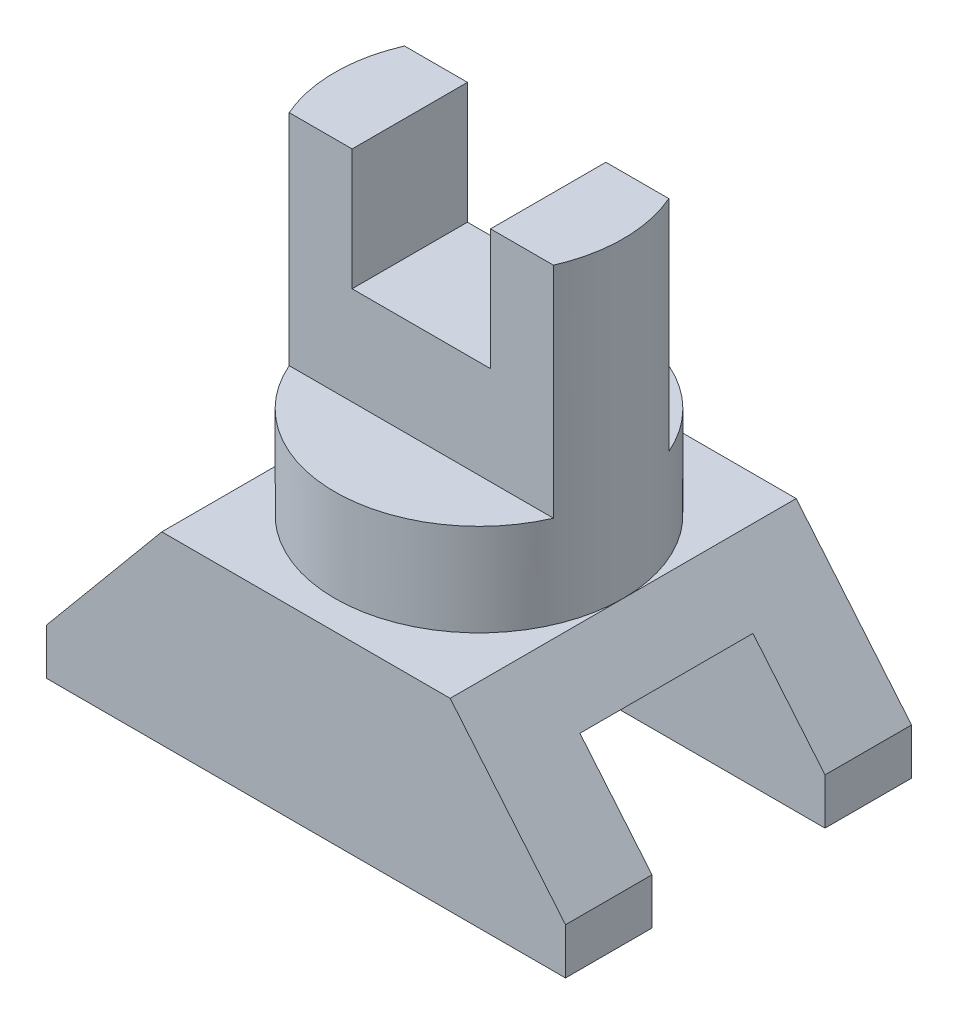
ISO-10303-21;
HEADER;
FILE_DESCRIPTION(('STEP AP214'),'2;1');
FILE_NAME('part.step','',(''),(''),'','','');
FILE_SCHEMA(('AUTOMOTIVE_DESIGN { 1 0 10303 214 1 1 1 1 }'));
ENDSEC;
DATA;
#1=APPLICATION_CONTEXT('core data for automotive mechanical design processes');
#2=APPLICATION_PROTOCOL_DEFINITION('international standard','automotive_design',2000,#1);
#3=PRODUCT_CONTEXT('',#1,'mechanical');
#4=PRODUCT('Part','Part','',(#3));
#5=PRODUCT_RELATED_PRODUCT_CATEGORY('part','',(#4));
#6=PRODUCT_DEFINITION_FORMATION('','',#4);
#7=PRODUCT_DEFINITION_CONTEXT('part definition',#1,'design');
#8=PRODUCT_DEFINITION('design','',#6,#7);
#9=PRODUCT_DEFINITION_SHAPE('','',#8);
#10=(LENGTH_UNIT() NAMED_UNIT(*) SI_UNIT(.MILLI.,.METRE.));
#11=(NAMED_UNIT(*) PLANE_ANGLE_UNIT() SI_UNIT($,.RADIAN.));
#12=(NAMED_UNIT(*) SI_UNIT($,.STERADIAN.) SOLID_ANGLE_UNIT());
#13=UNCERTAINTY_MEASURE_WITH_UNIT(LENGTH_MEASURE(1.E-05),#10,'distance_accuracy_value','');
#14=(GEOMETRIC_REPRESENTATION_CONTEXT(3) GLOBAL_UNCERTAINTY_ASSIGNED_CONTEXT((#13)) GLOBAL_UNIT_ASSIGNED_CONTEXT((#10,
#11,#12)) REPRESENTATION_CONTEXT('',''));
#15=CARTESIAN_POINT('',(0.,0.,0.));
#16=DIRECTION('',(0.,0.,1.));
#17=DIRECTION('',(1.,0.,0.));
#18=AXIS2_PLACEMENT_3D('',#15,#16,#17);
#19=CARTESIAN_POINT('',(-55.4325271535581,-19.0427034456929,60.));
#20=DIRECTION('',(1.,0.,0.));
#21=DIRECTION('',(0.,0.,-1.));
#22=AXIS2_PLACEMENT_3D('',#19,#20,#21);
#23=PLANE('',#22);
#24=DIRECTION('',(0.,0.,-1.));
#25=VECTOR('',#24,1.);
#26=CARTESIAN_POINT('',(-55.4325271535581,-19.0427034456929,60.));
#27=LINE('',#26,#25);
#28=CARTESIAN_POINT('',(-55.4325271535581,-19.0427034456929,60.));
#29=VERTEX_POINT('',#28);
#30=CARTESIAN_POINT('',(-55.4325271535581,-19.0427034456929,45.));
#31=VERTEX_POINT('',#30);
#32=EDGE_CURVE('E221',#29,#31,#27,.T.);
#33=ORIENTED_EDGE('',*,*,#32,.T.);
#34=DIRECTION('',(0.,-1.,0.));
#35=VECTOR('',#34,1.);
#36=CARTESIAN_POINT('',(-55.4325271535581,-19.0427034456929,45.));
#37=LINE('',#36,#35);
#38=CARTESIAN_POINT('',(-55.4325271535581,-27.0427034456929,45.));
#39=VERTEX_POINT('',#38);
#40=EDGE_CURVE('E262',#31,#39,#37,.T.);
#41=ORIENTED_EDGE('',*,*,#40,.T.);
#42=DIRECTION('',(0.,0.,-1.));
#43=VECTOR('',#42,1.);
#44=CARTESIAN_POINT('',(-55.4325271535581,-27.0427034456929,60.));
#45=LINE('',#44,#43);
#46=CARTESIAN_POINT('',(-55.4325271535581,-27.0427034456929,60.));
#47=VERTEX_POINT('',#46);
#48=EDGE_CURVE('E202',#47,#39,#45,.T.);
#49=ORIENTED_EDGE('',*,*,#48,.F.);
#50=DIRECTION('',(0.,-1.,0.));
#51=VECTOR('',#50,1.);
#52=CARTESIAN_POINT('',(-55.4325271535581,-19.0427034456929,60.));
#53=LINE('',#52,#51);
#54=EDGE_CURVE('E359',#29,#47,#53,.T.);
#55=ORIENTED_EDGE('',*,*,#54,.F.);
#56=EDGE_LOOP('',(#33,#41,#49,#55));
#57=FACE_BOUND('',#56,.T.);
#58=ADVANCED_FACE('F39',(#57),#23,.F.);
#59=CARTESIAN_POINT('',(-55.4325271535581,-27.0427034456929,60.));
#60=DIRECTION('',(0.,1.,0.));
#61=DIRECTION('',(0.,0.,1.));
#62=AXIS2_PLACEMENT_3D('',#59,#60,#61);
#63=PLANE('',#62);
#64=ORIENTED_EDGE('',*,*,#48,.T.);
#65=DIRECTION('',(1.,0.,0.));
#66=VECTOR('',#65,1.);
#67=CARTESIAN_POINT('',(-75.4325271535581,-27.0427034456929,45.));
#68=LINE('',#67,#66);
#69=CARTESIAN_POINT('',(34.5674728464419,-27.0427034456929,45.));
#70=VERTEX_POINT('',#69);
#71=EDGE_CURVE('E186',#39,#70,#68,.T.);
#72=ORIENTED_EDGE('',*,*,#71,.T.);
#73=DIRECTION('',(0.,0.,-1.));
#74=VECTOR('',#73,1.);
#75=CARTESIAN_POINT('',(34.5674728464419,-27.0427034456929,60.));
#76=LINE('',#75,#74);
#77=CARTESIAN_POINT('',(34.5674728464419,-27.0427034456929,60.));
#78=VERTEX_POINT('',#77);
#79=EDGE_CURVE('E199',#78,#70,#76,.T.);
#80=ORIENTED_EDGE('',*,*,#79,.F.);
#81=DIRECTION('',(1.,0.,0.));
#82=VECTOR('',#81,1.);
#83=CARTESIAN_POINT('',(-55.4325271535581,-27.0427034456929,60.));
#84=LINE('',#83,#82);
#85=EDGE_CURVE('E363',#47,#78,#84,.T.);
#86=ORIENTED_EDGE('',*,*,#85,.F.);
#87=EDGE_LOOP('',(#64,#72,#80,#86));
#88=FACE_BOUND('',#87,.T.);
#89=ADVANCED_FACE('F197',(#88),#63,.F.);
#90=CARTESIAN_POINT('',(34.5674728464419,-27.0427034456929,60.));
#91=DIRECTION('',(-1.,0.,0.));
#92=DIRECTION('',(0.,0.,1.));
#93=AXIS2_PLACEMENT_3D('',#90,#91,#92);
#94=PLANE('',#93);
#95=ORIENTED_EDGE('',*,*,#79,.T.);
#96=DIRECTION('',(0.,-1.,0.));
#97=VECTOR('',#96,1.);
#98=CARTESIAN_POINT('',(34.5674728464419,-27.0427034456929,45.));
#99=LINE('',#98,#97);
#100=CARTESIAN_POINT('',(34.5674728464419,-19.0427034456929,45.));
#101=VERTEX_POINT('',#100);
#102=EDGE_CURVE('E182',#101,#70,#99,.T.);
#103=ORIENTED_EDGE('',*,*,#102,.F.);
#104=DIRECTION('',(0.,0.,-1.));
#105=VECTOR('',#104,1.);
#106=CARTESIAN_POINT('',(34.5674728464419,-19.0427034456929,60.));
#107=LINE('',#106,#105);
#108=CARTESIAN_POINT('',(34.5674728464419,-19.0427034456929,60.));
#109=VERTEX_POINT('',#108);
#110=EDGE_CURVE('E215',#109,#101,#107,.T.);
#111=ORIENTED_EDGE('',*,*,#110,.F.);
#112=DIRECTION('',(0.,1.,0.));
#113=VECTOR('',#112,1.);
#114=CARTESIAN_POINT('',(34.5674728464419,-27.0427034456929,60.));
#115=LINE('',#114,#113);
#116=EDGE_CURVE('E207',#78,#109,#115,.T.);
#117=ORIENTED_EDGE('',*,*,#116,.F.);
#118=EDGE_LOOP('',(#95,#103,#111,#117));
#119=FACE_BOUND('',#118,.T.);
#120=ADVANCED_FACE('F206',(#119),#94,.F.);
#121=CARTESIAN_POINT('',(-10.4325271535581,20.9572965543071,30.));
#122=DIRECTION('',(0.,1.,0.));
#123=DIRECTION('',(0.,0.,1.));
#124=AXIS2_PLACEMENT_3D('',#121,#122,#123);
#125=PLANE('',#124);
#126=CARTESIAN_POINT('',(-10.4325271535581,20.9572965543071,30.));
#127=DIRECTION('',(0.,1.,0.));
#128=DIRECTION('',(0.,0.,1.));
#129=AXIS2_PLACEMENT_3D('',#126,#127,#128);
#130=CIRCLE('',#129,25.);
#131=CARTESIAN_POINT('',(-33.3454056283373,20.9572965543071,40.));
#132=VERTEX_POINT('',#131);
#133=CARTESIAN_POINT('',(12.4803513212211,20.9572965543071,40.));
#134=VERTEX_POINT('',#133);
#135=EDGE_CURVE('E347',#132,#134,#130,.T.);
#136=ORIENTED_EDGE('',*,*,#135,.T.);
#137=DIRECTION('',(1.,0.,0.));
#138=VECTOR('',#137,1.);
#139=CARTESIAN_POINT('',(0.,20.9572965543071,40.));
#140=LINE('',#139,#138);
#141=EDGE_CURVE('E62',#132,#134,#140,.T.);
#142=ORIENTED_EDGE('',*,*,#141,.F.);
#143=EDGE_LOOP('',(#136,#142));
#144=FACE_BOUND('',#143,.T.);
#145=ADVANCED_FACE('F464',(#144),#125,.T.);
#146=CARTESIAN_POINT('',(-35.4325271535581,4.95729655430712,60.));
#147=DIRECTION('',(0.,-1.,0.));
#148=DIRECTION('',(0.,0.,-1.));
#149=AXIS2_PLACEMENT_3D('',#146,#147,#148);
#150=PLANE('',#149);
#151=CARTESIAN_POINT('',(-10.4325271535581,4.95729655430712,30.));
#152=DIRECTION('',(0.,1.,0.));
#153=DIRECTION('',(0.,0.,1.));
#154=AXIS2_PLACEMENT_3D('',#151,#152,#153);
#155=CIRCLE('',#154,25.);
#156=CARTESIAN_POINT('',(14.5674728464419,4.95729655430712,30.));
#157=VERTEX_POINT('',#156);
#158=CARTESIAN_POINT('',(-35.4325271535581,4.95729655430712,30.));
#159=VERTEX_POINT('',#158);
#160=EDGE_CURVE('E342',#157,#159,#155,.T.);
#161=ORIENTED_EDGE('',*,*,#160,.F.);
#162=DIRECTION('',(0.,0.,-1.));
#163=VECTOR('',#162,1.);
#164=CARTESIAN_POINT('',(14.5674728464419,4.95729655430712,60.));
#165=LINE('',#164,#163);
#166=CARTESIAN_POINT('',(14.5674728464419,4.95729655430712,0.));
#167=VERTEX_POINT('',#166);
#168=EDGE_CURVE('E400',#157,#167,#165,.T.);
#169=ORIENTED_EDGE('',*,*,#168,.T.);
#170=DIRECTION('',(-1.,0.,0.));
#171=VECTOR('',#170,1.);
#172=CARTESIAN_POINT('',(-35.4325271535581,4.95729655430712,0.));
#173=LINE('',#172,#171);
#174=CARTESIAN_POINT('',(-35.4325271535581,4.95729655430712,0.));
#175=VERTEX_POINT('',#174);
#176=EDGE_CURVE('E360',#167,#175,#173,.T.);
#177=ORIENTED_EDGE('',*,*,#176,.T.);
#178=DIRECTION('',(0.,0.,-1.));
#179=VECTOR('',#178,1.);
#180=CARTESIAN_POINT('',(-35.4325271535581,4.95729655430712,60.));
#181=LINE('',#180,#179);
#182=EDGE_CURVE('E374',#159,#175,#181,.T.);
#183=ORIENTED_EDGE('',*,*,#182,.F.);
#184=EDGE_LOOP('',(#161,#169,#177,#183));
#185=FACE_BOUND('',#184,.T.);
#186=ADVANCED_FACE('F412',(#185),#150,.F.);
#187=CARTESIAN_POINT('',(-35.4325271535581,4.95729655430712,60.));
#188=DIRECTION('',(0.768221279597376,-0.64018439966448,0.));
#189=DIRECTION('',(0.64018439966448,0.768221279597376,0.));
#190=AXIS2_PLACEMENT_3D('',#187,#188,#189);
#191=PLANE('',#190);
#192=DIRECTION('',(0.,0.,1.));
#193=VECTOR('',#192,1.);
#194=CARTESIAN_POINT('',(-42.9325271535581,-4.04270344569288,60.));
#195=LINE('',#194,#193);
#196=CARTESIAN_POINT('',(-42.9325271535581,-4.04270344569288,15.));
#197=VERTEX_POINT('',#196);
#198=CARTESIAN_POINT('',(-42.9325271535581,-4.04270344569288,45.));
#199=VERTEX_POINT('',#198);
#200=EDGE_CURVE('E259',#197,#199,#195,.T.);
#201=ORIENTED_EDGE('',*,*,#200,.T.);
#202=DIRECTION('',(-0.64018439966448,-0.768221279597376,0.));
#203=VECTOR('',#202,1.);
#204=CARTESIAN_POINT('',(-35.4325271535581,4.95729655430712,45.));
#205=LINE('',#204,#203);
#206=EDGE_CURVE('E242',#199,#31,#205,.T.);
#207=ORIENTED_EDGE('',*,*,#206,.T.);
#208=ORIENTED_EDGE('',*,*,#32,.F.);
#209=DIRECTION('',(-0.64018439966448,-0.768221279597376,0.));
#210=VECTOR('',#209,1.);
#211=CARTESIAN_POINT('',(-35.4325271535581,4.95729655430712,60.));
#212=LINE('',#211,#210);
#213=CARTESIAN_POINT('',(-35.4325271535581,4.95729655430712,60.));
#214=VERTEX_POINT('',#213);
#215=EDGE_CURVE('E355',#214,#29,#212,.T.);
#216=ORIENTED_EDGE('',*,*,#215,.F.);
#217=EDGE_CURVE('E397',#214,#159,#181,.T.);
#218=ORIENTED_EDGE('',*,*,#217,.T.);
#219=ORIENTED_EDGE('',*,*,#182,.T.);
#220=DIRECTION('',(-0.64018439966448,-0.768221279597376,0.));
#221=VECTOR('',#220,1.);
#222=CARTESIAN_POINT('',(-35.4325271535581,4.95729655430712,0.));
#223=LINE('',#222,#221);
#224=CARTESIAN_POINT('',(-55.4325271535581,-19.0427034456929,0.));
#225=VERTEX_POINT('',#224);
#226=EDGE_CURVE('E350',#175,#225,#223,.T.);
#227=ORIENTED_EDGE('',*,*,#226,.T.);
#228=CARTESIAN_POINT('',(-55.4325271535581,-19.0427034456929,15.));
#229=VERTEX_POINT('',#228);
#230=EDGE_CURVE('E220',#229,#225,#27,.T.);
#231=ORIENTED_EDGE('',*,*,#230,.F.);
#232=DIRECTION('',(0.64018439966448,0.768221279597376,0.));
#233=VECTOR('',#232,1.);
#234=CARTESIAN_POINT('',(-35.4325271535581,4.95729655430712,15.));
#235=LINE('',#234,#233);
#236=EDGE_CURVE('E249',#229,#197,#235,.T.);
#237=ORIENTED_EDGE('',*,*,#236,.T.);
#238=EDGE_LOOP('',(#201,#207,#208,#216,#218,#219,#227,#231,#237));
#239=FACE_BOUND('',#238,.T.);
#240=ADVANCED_FACE('F41',(#239),#191,.F.);
#241=CARTESIAN_POINT('',(-55.4325271535581,-27.0427034456929,15.));
#242=VERTEX_POINT('',#241);
#243=CARTESIAN_POINT('',(-55.4325271535581,-27.0427034456929,0.));
#244=VERTEX_POINT('',#243);
#245=EDGE_CURVE('E209',#242,#244,#45,.T.);
#246=ORIENTED_EDGE('',*,*,#245,.F.);
#247=DIRECTION('',(0.,1.,0.));
#248=VECTOR('',#247,1.);
#249=CARTESIAN_POINT('',(-55.4325271535581,-19.0427034456929,15.));
#250=LINE('',#249,#248);
#251=EDGE_CURVE('E244',#242,#229,#250,.T.);
#252=ORIENTED_EDGE('',*,*,#251,.T.);
#253=ORIENTED_EDGE('',*,*,#230,.T.);
#254=DIRECTION('',(0.,-1.,0.));
#255=VECTOR('',#254,1.);
#256=CARTESIAN_POINT('',(-55.4325271535581,-19.0427034456929,0.));
#257=LINE('',#256,#255);
#258=EDGE_CURVE('E378',#225,#244,#257,.T.);
#259=ORIENTED_EDGE('',*,*,#258,.T.);
#260=EDGE_LOOP('',(#246,#252,#253,#259));
#261=FACE_BOUND('',#260,.T.);
#262=ADVANCED_FACE('F480',(#261),#23,.F.);
#263=CARTESIAN_POINT('',(34.5674728464419,-27.0427034456929,15.));
#264=VERTEX_POINT('',#263);
#265=CARTESIAN_POINT('',(34.5674728464419,-27.0427034456929,0.));
#266=VERTEX_POINT('',#265);
#267=EDGE_CURVE('E210',#264,#266,#76,.T.);
#268=ORIENTED_EDGE('',*,*,#267,.F.);
#269=DIRECTION('',(1.,0.,0.));
#270=VECTOR('',#269,1.);
#271=CARTESIAN_POINT('',(-75.4325271535581,-27.0427034456929,15.));
#272=LINE('',#271,#270);
#273=EDGE_CURVE('E204',#242,#264,#272,.T.);
#274=ORIENTED_EDGE('',*,*,#273,.F.);
#275=ORIENTED_EDGE('',*,*,#245,.T.);
#276=DIRECTION('',(1.,0.,0.));
#277=VECTOR('',#276,1.);
#278=CARTESIAN_POINT('',(-55.4325271535581,-27.0427034456929,0.));
#279=LINE('',#278,#277);
#280=EDGE_CURVE('E382',#244,#266,#279,.T.);
#281=ORIENTED_EDGE('',*,*,#280,.T.);
#282=EDGE_LOOP('',(#268,#274,#275,#281));
#283=FACE_BOUND('',#282,.T.);
#284=ADVANCED_FACE('F485',(#283),#63,.F.);
#285=CARTESIAN_POINT('',(34.5674728464419,-19.0427034456929,15.));
#286=VERTEX_POINT('',#285);
#287=CARTESIAN_POINT('',(34.5674728464419,-19.0427034456929,0.));
#288=VERTEX_POINT('',#287);
#289=EDGE_CURVE('E403',#286,#288,#107,.T.);
#290=ORIENTED_EDGE('',*,*,#289,.F.);
#291=DIRECTION('',(0.,1.,0.));
#292=VECTOR('',#291,1.);
#293=CARTESIAN_POINT('',(34.5674728464419,-27.0427034456929,15.));
#294=LINE('',#293,#292);
#295=EDGE_CURVE('E55',#264,#286,#294,.T.);
#296=ORIENTED_EDGE('',*,*,#295,.F.);
#297=ORIENTED_EDGE('',*,*,#267,.T.);
#298=DIRECTION('',(0.,1.,0.));
#299=VECTOR('',#298,1.);
#300=CARTESIAN_POINT('',(34.5674728464419,-27.0427034456929,0.));
#301=LINE('',#300,#299);
#302=EDGE_CURVE('E386',#266,#288,#301,.T.);
#303=ORIENTED_EDGE('',*,*,#302,.T.);
#304=EDGE_LOOP('',(#290,#296,#297,#303));
#305=FACE_BOUND('',#304,.T.);
#306=ADVANCED_FACE('F474',(#305),#94,.F.);
#307=CARTESIAN_POINT('',(14.5674728464419,4.95729655430712,60.));
#308=DIRECTION('',(-0.768221279597376,-0.64018439966448,0.));
#309=DIRECTION('',(0.64018439966448,-0.768221279597376,0.));
#310=AXIS2_PLACEMENT_3D('',#307,#308,#309);
#311=PLANE('',#310);
#312=ORIENTED_EDGE('',*,*,#110,.T.);
#313=DIRECTION('',(-0.64018439966448,0.768221279597376,0.));
#314=VECTOR('',#313,1.);
#315=CARTESIAN_POINT('',(14.5674728464419,4.95729655430712,45.));
#316=LINE('',#315,#314);
#317=CARTESIAN_POINT('',(22.0674728464419,-4.04270344569288,45.));
#318=VERTEX_POINT('',#317);
#319=EDGE_CURVE('E11',#101,#318,#316,.T.);
#320=ORIENTED_EDGE('',*,*,#319,.T.);
#321=DIRECTION('',(0.,0.,-1.));
#322=VECTOR('',#321,1.);
#323=CARTESIAN_POINT('',(22.0674728464419,-4.04270344569288,60.));
#324=LINE('',#323,#322);
#325=CARTESIAN_POINT('',(22.0674728464419,-4.04270344569287,15.));
#326=VERTEX_POINT('',#325);
#327=EDGE_CURVE('E48',#318,#326,#324,.T.);
#328=ORIENTED_EDGE('',*,*,#327,.T.);
#329=DIRECTION('',(0.64018439966448,-0.768221279597376,0.));
#330=VECTOR('',#329,1.);
#331=CARTESIAN_POINT('',(14.5674728464419,4.95729655430712,15.));
#332=LINE('',#331,#330);
#333=EDGE_CURVE('E226',#326,#286,#332,.T.);
#334=ORIENTED_EDGE('',*,*,#333,.T.);
#335=ORIENTED_EDGE('',*,*,#289,.T.);
#336=DIRECTION('',(-0.64018439966448,0.768221279597376,0.));
#337=VECTOR('',#336,1.);
#338=CARTESIAN_POINT('',(14.5674728464419,4.95729655430712,0.));
#339=LINE('',#338,#337);
#340=EDGE_CURVE('E390',#288,#167,#339,.T.);
#341=ORIENTED_EDGE('',*,*,#340,.T.);
#342=ORIENTED_EDGE('',*,*,#168,.F.);
#343=CARTESIAN_POINT('',(14.5674728464419,4.95729655430712,60.));
#344=VERTEX_POINT('',#343);
#345=EDGE_CURVE('E401',#344,#157,#165,.T.);
#346=ORIENTED_EDGE('',*,*,#345,.F.);
#347=DIRECTION('',(-0.64018439966448,0.768221279597376,0.));
#348=VECTOR('',#347,1.);
#349=CARTESIAN_POINT('',(14.5674728464419,4.95729655430712,60.));
#350=LINE('',#349,#348);
#351=EDGE_CURVE('E368',#109,#344,#350,.T.);
#352=ORIENTED_EDGE('',*,*,#351,.F.);
#353=EDGE_LOOP('',(#312,#320,#328,#334,#335,#341,#342,#346,#352));
#354=FACE_BOUND('',#353,.T.);
#355=ADVANCED_FACE('F231',(#354),#311,.F.);
#356=EDGE_CURVE('E225',#159,#157,#155,.T.);
#357=ORIENTED_EDGE('',*,*,#356,.F.);
#358=ORIENTED_EDGE('',*,*,#217,.F.);
#359=DIRECTION('',(-1.,0.,0.));
#360=VECTOR('',#359,1.);
#361=CARTESIAN_POINT('',(-35.4325271535581,4.95729655430712,60.));
#362=LINE('',#361,#360);
#363=EDGE_CURVE('E371',#344,#214,#362,.T.);
#364=ORIENTED_EDGE('',*,*,#363,.F.);
#365=ORIENTED_EDGE('',*,*,#345,.T.);
#366=EDGE_LOOP('',(#357,#358,#364,#365));
#367=FACE_BOUND('',#366,.T.);
#368=ADVANCED_FACE('F472',(#367),#150,.F.);
#369=CARTESIAN_POINT('',(0.,0.,60.));
#370=DIRECTION('',(0.,0.,1.));
#371=DIRECTION('',(1.,0.,0.));
#372=AXIS2_PLACEMENT_3D('',#369,#370,#371);
#373=PLANE('',#372);
#374=ORIENTED_EDGE('',*,*,#215,.T.);
#375=ORIENTED_EDGE('',*,*,#54,.T.);
#376=ORIENTED_EDGE('',*,*,#85,.T.);
#377=ORIENTED_EDGE('',*,*,#116,.T.);
#378=ORIENTED_EDGE('',*,*,#351,.T.);
#379=ORIENTED_EDGE('',*,*,#363,.T.);
#380=EDGE_LOOP('',(#374,#375,#376,#377,#378,#379));
#381=FACE_BOUND('',#380,.T.);
#382=ADVANCED_FACE('F506',(#381),#373,.T.);
#383=CARTESIAN_POINT('',(0.,0.,0.));
#384=DIRECTION('',(0.,0.,1.));
#385=DIRECTION('',(1.,0.,0.));
#386=AXIS2_PLACEMENT_3D('',#383,#384,#385);
#387=PLANE('',#386);
#388=ORIENTED_EDGE('',*,*,#226,.F.);
#389=ORIENTED_EDGE('',*,*,#176,.F.);
#390=ORIENTED_EDGE('',*,*,#340,.F.);
#391=ORIENTED_EDGE('',*,*,#302,.F.);
#392=ORIENTED_EDGE('',*,*,#280,.F.);
#393=ORIENTED_EDGE('',*,*,#258,.F.);
#394=EDGE_LOOP('',(#388,#389,#390,#391,#392,#393));
#395=FACE_BOUND('',#394,.T.);
#396=ADVANCED_FACE('F420',(#395),#387,.F.);
#397=CARTESIAN_POINT('',(-10.4325271535581,20.9572965543071,30.));
#398=DIRECTION('',(0.,-1.,0.));
#399=DIRECTION('',(0.,0.,-1.));
#400=AXIS2_PLACEMENT_3D('',#397,#398,#399);
#401=CYLINDRICAL_SURFACE('',#400,25.);
#402=ORIENTED_EDGE('',*,*,#135,.F.);
#403=DIRECTION('',(0.,-1.,0.));
#404=VECTOR('',#403,1.);
#405=CARTESIAN_POINT('',(-33.3454056283373,58.9572965543071,40.));
#406=LINE('',#405,#404);
#407=CARTESIAN_POINT('',(-33.3454056283373,58.9572965543071,40.));
#408=VERTEX_POINT('',#407);
#409=EDGE_CURVE('E309',#408,#132,#406,.T.);
#410=ORIENTED_EDGE('',*,*,#409,.F.);
#411=CARTESIAN_POINT('',(-10.4325271535581,58.9572965543071,30.));
#412=DIRECTION('',(0.,1.,0.));
#413=DIRECTION('',(0.,0.,1.));
#414=AXIS2_PLACEMENT_3D('',#411,#412,#413);
#415=CIRCLE('',#414,25.);
#416=CARTESIAN_POINT('',(-33.3454056283373,58.9572965543071,20.));
#417=VERTEX_POINT('',#416);
#418=EDGE_CURVE('E306',#417,#408,#415,.T.);
#419=ORIENTED_EDGE('',*,*,#418,.F.);
#420=DIRECTION('',(0.,-1.,0.));
#421=VECTOR('',#420,1.);
#422=CARTESIAN_POINT('',(-33.3454056283373,58.9572965543071,20.));
#423=LINE('',#422,#421);
#424=CARTESIAN_POINT('',(-33.3454056283373,20.9572965543071,20.));
#425=VERTEX_POINT('',#424);
#426=EDGE_CURVE('E313',#417,#425,#423,.T.);
#427=ORIENTED_EDGE('',*,*,#426,.T.);
#428=CARTESIAN_POINT('',(12.4803513212211,20.9572965543071,20.));
#429=VERTEX_POINT('',#428);
#430=EDGE_CURVE('E351',#429,#425,#130,.T.);
#431=ORIENTED_EDGE('',*,*,#430,.F.);
#432=DIRECTION('',(0.,-1.,0.));
#433=VECTOR('',#432,1.);
#434=CARTESIAN_POINT('',(12.4803513212211,58.9572965543071,20.));
#435=LINE('',#434,#433);
#436=CARTESIAN_POINT('',(12.4803513212211,58.9572965543071,20.));
#437=VERTEX_POINT('',#436);
#438=EDGE_CURVE('E284',#437,#429,#435,.T.);
#439=ORIENTED_EDGE('',*,*,#438,.F.);
#440=CARTESIAN_POINT('',(-10.4325271535581,58.9572965543071,30.));
#441=DIRECTION('',(0.,1.,0.));
#442=DIRECTION('',(0.,0.,1.));
#443=AXIS2_PLACEMENT_3D('',#440,#441,#442);
#444=CIRCLE('',#443,25.);
#445=CARTESIAN_POINT('',(12.4803513212211,58.9572965543071,40.));
#446=VERTEX_POINT('',#445);
#447=EDGE_CURVE('E274',#446,#437,#444,.T.);
#448=ORIENTED_EDGE('',*,*,#447,.F.);
#449=DIRECTION('',(0.,-1.,0.));
#450=VECTOR('',#449,1.);
#451=CARTESIAN_POINT('',(12.4803513212211,58.9572965543071,40.));
#452=LINE('',#451,#450);
#453=EDGE_CURVE('E288',#446,#134,#452,.T.);
#454=ORIENTED_EDGE('',*,*,#453,.T.);
#455=EDGE_LOOP('',(#402,#410,#419,#427,#431,#439,#448,#454));
#456=FACE_BOUND('',#455,.T.);
#457=ORIENTED_EDGE('',*,*,#160,.T.);
#458=ORIENTED_EDGE('',*,*,#356,.T.);
#459=EDGE_LOOP('',(#457,#458));
#460=FACE_BOUND('',#459,.T.);
#461=ADVANCED_FACE('F440',(#456,#460),#401,.T.);
#462=DIRECTION('',(1.,0.,0.));
#463=VECTOR('',#462,1.);
#464=CARTESIAN_POINT('',(0.,20.9572965543071,20.));
#465=LINE('',#464,#463);
#466=EDGE_CURVE('E330',#425,#429,#465,.T.);
#467=ORIENTED_EDGE('',*,*,#466,.T.);
#468=ORIENTED_EDGE('',*,*,#430,.T.);
#469=EDGE_LOOP('',(#467,#468));
#470=FACE_BOUND('',#469,.T.);
#471=ADVANCED_FACE('F432',(#470),#125,.T.);
#472=CARTESIAN_POINT('',(0.,37.9572965543071,40.));
#473=DIRECTION('',(0.,0.,-1.));
#474=DIRECTION('',(-1.,0.,0.));
#475=AXIS2_PLACEMENT_3D('',#472,#473,#474);
#476=PLANE('',#475);
#477=ORIENTED_EDGE('',*,*,#141,.T.);
#478=ORIENTED_EDGE('',*,*,#453,.F.);
#479=DIRECTION('',(1.,0.,0.));
#480=VECTOR('',#479,1.);
#481=CARTESIAN_POINT('',(0.,58.9572965543071,40.));
#482=LINE('',#481,#480);
#483=CARTESIAN_POINT('',(1.56747284644246,58.9572965543071,40.));
#484=VERTEX_POINT('',#483);
#485=EDGE_CURVE('E271',#484,#446,#482,.T.);
#486=ORIENTED_EDGE('',*,*,#485,.F.);
#487=DIRECTION('',(0.,-1.,0.));
#488=VECTOR('',#487,1.);
#489=CARTESIAN_POINT('',(1.56747284644246,58.9572965543071,40.));
#490=LINE('',#489,#488);
#491=CARTESIAN_POINT('',(1.56747284644246,37.9572965543071,40.));
#492=VERTEX_POINT('',#491);
#493=EDGE_CURVE('E292',#484,#492,#490,.T.);
#494=ORIENTED_EDGE('',*,*,#493,.T.);
#495=DIRECTION('',(1.,0.,0.));
#496=VECTOR('',#495,1.);
#497=CARTESIAN_POINT('',(0.,37.9572965543071,40.));
#498=LINE('',#497,#496);
#499=CARTESIAN_POINT('',(-22.4325271535583,37.9572965543071,40.));
#500=VERTEX_POINT('',#499);
#501=EDGE_CURVE('E325',#500,#492,#498,.T.);
#502=ORIENTED_EDGE('',*,*,#501,.F.);
#503=DIRECTION('',(0.,-1.,0.));
#504=VECTOR('',#503,1.);
#505=CARTESIAN_POINT('',(-22.4325271535583,58.9572965543071,40.));
#506=LINE('',#505,#504);
#507=CARTESIAN_POINT('',(-22.4325271535583,58.9572965543071,40.));
#508=VERTEX_POINT('',#507);
#509=EDGE_CURVE('E321',#508,#500,#506,.T.);
#510=ORIENTED_EDGE('',*,*,#509,.F.);
#511=DIRECTION('',(-1.,0.,0.));
#512=VECTOR('',#511,1.);
#513=CARTESIAN_POINT('',(0.,58.9572965543071,40.));
#514=LINE('',#513,#512);
#515=EDGE_CURVE('E296',#508,#408,#514,.T.);
#516=ORIENTED_EDGE('',*,*,#515,.T.);
#517=ORIENTED_EDGE('',*,*,#409,.T.);
#518=EDGE_LOOP('',(#477,#478,#486,#494,#502,#510,#516,#517));
#519=FACE_BOUND('',#518,.T.);
#520=ADVANCED_FACE('F457',(#519),#476,.F.);
#521=CARTESIAN_POINT('',(0.,37.9572965543071,20.));
#522=DIRECTION('',(0.,0.,-1.));
#523=DIRECTION('',(-1.,0.,0.));
#524=AXIS2_PLACEMENT_3D('',#521,#522,#523);
#525=PLANE('',#524);
#526=ORIENTED_EDGE('',*,*,#466,.F.);
#527=ORIENTED_EDGE('',*,*,#426,.F.);
#528=DIRECTION('',(-1.,0.,0.));
#529=VECTOR('',#528,1.);
#530=CARTESIAN_POINT('',(0.,58.9572965543071,20.));
#531=LINE('',#530,#529);
#532=CARTESIAN_POINT('',(-22.4325271535582,58.9572965543071,20.));
#533=VERTEX_POINT('',#532);
#534=EDGE_CURVE('E303',#533,#417,#531,.T.);
#535=ORIENTED_EDGE('',*,*,#534,.F.);
#536=DIRECTION('',(0.,-1.,0.));
#537=VECTOR('',#536,1.);
#538=CARTESIAN_POINT('',(-22.4325271535582,58.9572965543071,20.));
#539=LINE('',#538,#537);
#540=CARTESIAN_POINT('',(-22.4325271535582,37.9572965543071,20.));
#541=VERTEX_POINT('',#540);
#542=EDGE_CURVE('E317',#533,#541,#539,.T.);
#543=ORIENTED_EDGE('',*,*,#542,.T.);
#544=DIRECTION('',(1.,0.,0.));
#545=VECTOR('',#544,1.);
#546=CARTESIAN_POINT('',(0.,37.9572965543071,20.));
#547=LINE('',#546,#545);
#548=CARTESIAN_POINT('',(1.56747284644246,37.9572965543071,20.));
#549=VERTEX_POINT('',#548);
#550=EDGE_CURVE('E334',#541,#549,#547,.T.);
#551=ORIENTED_EDGE('',*,*,#550,.T.);
#552=DIRECTION('',(0.,-1.,0.));
#553=VECTOR('',#552,1.);
#554=CARTESIAN_POINT('',(1.56747284644246,58.9572965543071,20.));
#555=LINE('',#554,#553);
#556=CARTESIAN_POINT('',(1.56747284644246,58.9572965543071,20.));
#557=VERTEX_POINT('',#556);
#558=EDGE_CURVE('E281',#557,#549,#555,.T.);
#559=ORIENTED_EDGE('',*,*,#558,.F.);
#560=DIRECTION('',(1.,0.,0.));
#561=VECTOR('',#560,1.);
#562=CARTESIAN_POINT('',(0.,58.9572965543071,20.));
#563=LINE('',#562,#561);
#564=EDGE_CURVE('E277',#557,#437,#563,.T.);
#565=ORIENTED_EDGE('',*,*,#564,.T.);
#566=ORIENTED_EDGE('',*,*,#438,.T.);
#567=EDGE_LOOP('',(#526,#527,#535,#543,#551,#559,#565,#566));
#568=FACE_BOUND('',#567,.T.);
#569=ADVANCED_FACE('F437',(#568),#525,.T.);
#570=CARTESIAN_POINT('',(0.,37.9572965543071,0.));
#571=DIRECTION('',(0.,1.,0.));
#572=DIRECTION('',(0.,0.,1.));
#573=AXIS2_PLACEMENT_3D('',#570,#571,#572);
#574=PLANE('',#573);
#575=ORIENTED_EDGE('',*,*,#501,.T.);
#576=DIRECTION('',(0.,0.,-1.));
#577=VECTOR('',#576,1.);
#578=CARTESIAN_POINT('',(1.56747284644246,37.9572965543071,0.));
#579=LINE('',#578,#577);
#580=EDGE_CURVE('E329',#492,#549,#579,.T.);
#581=ORIENTED_EDGE('',*,*,#580,.T.);
#582=ORIENTED_EDGE('',*,*,#550,.F.);
#583=DIRECTION('',(0.,0.,-1.));
#584=VECTOR('',#583,1.);
#585=CARTESIAN_POINT('',(-22.4325271535582,37.9572965543071,0.));
#586=LINE('',#585,#584);
#587=EDGE_CURVE('E338',#500,#541,#586,.T.);
#588=ORIENTED_EDGE('',*,*,#587,.F.);
#589=EDGE_LOOP('',(#575,#581,#582,#588));
#590=FACE_BOUND('',#589,.T.);
#591=ADVANCED_FACE('F452',(#590),#574,.T.);
#592=CARTESIAN_POINT('',(-22.4325271535582,58.9572965543071,0.));
#593=DIRECTION('',(-1.,0.,0.));
#594=DIRECTION('',(0.,0.,1.));
#595=AXIS2_PLACEMENT_3D('',#592,#593,#594);
#596=PLANE('',#595);
#597=ORIENTED_EDGE('',*,*,#587,.T.);
#598=ORIENTED_EDGE('',*,*,#542,.F.);
#599=DIRECTION('',(0.,0.,-1.));
#600=VECTOR('',#599,1.);
#601=CARTESIAN_POINT('',(-22.4325271535582,58.9572965543071,0.));
#602=LINE('',#601,#600);
#603=EDGE_CURVE('E300',#508,#533,#602,.T.);
#604=ORIENTED_EDGE('',*,*,#603,.F.);
#605=ORIENTED_EDGE('',*,*,#509,.T.);
#606=EDGE_LOOP('',(#597,#598,#604,#605));
#607=FACE_BOUND('',#606,.T.);
#608=ADVANCED_FACE('F449',(#607),#596,.F.);
#609=CARTESIAN_POINT('',(0.,58.9572965543071,0.));
#610=DIRECTION('',(0.,1.,0.));
#611=DIRECTION('',(0.,0.,1.));
#612=AXIS2_PLACEMENT_3D('',#609,#610,#611);
#613=PLANE('',#612);
#614=ORIENTED_EDGE('',*,*,#515,.F.);
#615=ORIENTED_EDGE('',*,*,#603,.T.);
#616=ORIENTED_EDGE('',*,*,#534,.T.);
#617=ORIENTED_EDGE('',*,*,#418,.T.);
#618=EDGE_LOOP('',(#614,#615,#616,#617));
#619=FACE_BOUND('',#618,.T.);
#620=ADVANCED_FACE('F445',(#619),#613,.T.);
#621=CARTESIAN_POINT('',(1.56747284644246,58.9572965543071,0.));
#622=DIRECTION('',(-1.,0.,0.));
#623=DIRECTION('',(0.,0.,1.));
#624=AXIS2_PLACEMENT_3D('',#621,#622,#623);
#625=PLANE('',#624);
#626=ORIENTED_EDGE('',*,*,#558,.T.);
#627=ORIENTED_EDGE('',*,*,#580,.F.);
#628=ORIENTED_EDGE('',*,*,#493,.F.);
#629=DIRECTION('',(0.,0.,-1.));
#630=VECTOR('',#629,1.);
#631=CARTESIAN_POINT('',(1.56747284644246,58.9572965543071,0.));
#632=LINE('',#631,#630);
#633=EDGE_CURVE('E267',#484,#557,#632,.T.);
#634=ORIENTED_EDGE('',*,*,#633,.T.);
#635=EDGE_LOOP('',(#626,#627,#628,#634));
#636=FACE_BOUND('',#635,.T.);
#637=ADVANCED_FACE('F454',(#636),#625,.T.);
#638=CARTESIAN_POINT('',(0.,58.9572965543071,0.));
#639=DIRECTION('',(0.,1.,0.));
#640=DIRECTION('',(0.,0.,1.));
#641=AXIS2_PLACEMENT_3D('',#638,#639,#640);
#642=PLANE('',#641);
#643=ORIENTED_EDGE('',*,*,#633,.F.);
#644=ORIENTED_EDGE('',*,*,#485,.T.);
#645=ORIENTED_EDGE('',*,*,#447,.T.);
#646=ORIENTED_EDGE('',*,*,#564,.F.);
#647=EDGE_LOOP('',(#643,#644,#645,#646));
#648=FACE_BOUND('',#647,.T.);
#649=ADVANCED_FACE('F463',(#648),#642,.T.);
#650=CARTESIAN_POINT('',(-75.4325271535581,-27.0427034456929,45.));
#651=DIRECTION('',(0.,0.,1.));
#652=DIRECTION('',(1.,0.,0.));
#653=AXIS2_PLACEMENT_3D('',#650,#651,#652);
#654=PLANE('',#653);
#655=DIRECTION('',(1.,0.,0.));
#656=VECTOR('',#655,1.);
#657=CARTESIAN_POINT('',(-75.4325271535581,-4.04270344569288,45.));
#658=LINE('',#657,#656);
#659=EDGE_CURVE('E237',#199,#318,#658,.T.);
#660=ORIENTED_EDGE('',*,*,#659,.T.);
#661=ORIENTED_EDGE('',*,*,#319,.F.);
#662=ORIENTED_EDGE('',*,*,#102,.T.);
#663=ORIENTED_EDGE('',*,*,#71,.F.);
#664=ORIENTED_EDGE('',*,*,#40,.F.);
#665=ORIENTED_EDGE('',*,*,#206,.F.);
#666=EDGE_LOOP('',(#660,#661,#662,#663,#664,#665));
#667=FACE_BOUND('',#666,.T.);
#668=ADVANCED_FACE('F185',(#667),#654,.F.);
#669=CARTESIAN_POINT('',(-75.4325271535581,-4.04270344569288,45.));
#670=DIRECTION('',(0.,1.,0.));
#671=DIRECTION('',(0.,0.,1.));
#672=AXIS2_PLACEMENT_3D('',#669,#670,#671);
#673=PLANE('',#672);
#674=DIRECTION('',(1.,0.,0.));
#675=VECTOR('',#674,1.);
#676=CARTESIAN_POINT('',(-75.4325271535581,-4.04270344569288,15.));
#677=LINE('',#676,#675);
#678=EDGE_CURVE('E240',#197,#326,#677,.T.);
#679=ORIENTED_EDGE('',*,*,#678,.T.);
#680=ORIENTED_EDGE('',*,*,#327,.F.);
#681=ORIENTED_EDGE('',*,*,#659,.F.);
#682=ORIENTED_EDGE('',*,*,#200,.F.);
#683=EDGE_LOOP('',(#679,#680,#681,#682));
#684=FACE_BOUND('',#683,.T.);
#685=ADVANCED_FACE('F236',(#684),#673,.F.);
#686=CARTESIAN_POINT('',(-75.4325271535581,-27.0427034456929,15.));
#687=DIRECTION('',(0.,0.,-1.));
#688=DIRECTION('',(-1.,0.,0.));
#689=AXIS2_PLACEMENT_3D('',#686,#687,#688);
#690=PLANE('',#689);
#691=ORIENTED_EDGE('',*,*,#251,.F.);
#692=ORIENTED_EDGE('',*,*,#273,.T.);
#693=ORIENTED_EDGE('',*,*,#295,.T.);
#694=ORIENTED_EDGE('',*,*,#333,.F.);
#695=ORIENTED_EDGE('',*,*,#678,.F.);
#696=ORIENTED_EDGE('',*,*,#236,.F.);
#697=EDGE_LOOP('',(#691,#692,#693,#694,#695,#696));
#698=FACE_BOUND('',#697,.T.);
#699=ADVANCED_FACE('F496',(#698),#690,.F.);
#700=CLOSED_SHELL('',(#58,#89,#120,#145,#186,#240,#262,#284,#306,#355,#368,#382,#396,#461,#471,
#520,#569,#591,#608,#620,#637,#649,#668,#685,#699));
#701=MANIFOLD_SOLID_BREP('B2',#700);
#702=ADVANCED_BREP_SHAPE_REPRESENTATION('',(#18,#701),#14);
#703=SHAPE_DEFINITION_REPRESENTATION(#9,#702);
ENDSEC;
END-ISO-10303-21;
